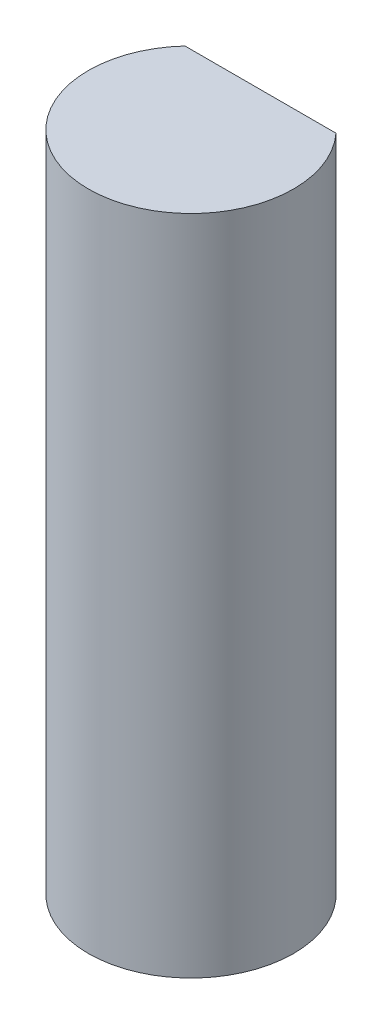
ISO-10303-21;
HEADER;
FILE_DESCRIPTION(('STEP AP214'),'2;1');
FILE_NAME('part.step','',(''),(''),'','','');
FILE_SCHEMA(('AUTOMOTIVE_DESIGN { 1 0 10303 214 1 1 1 1 }'));
ENDSEC;
DATA;
#1=APPLICATION_CONTEXT('core data for automotive mechanical design processes');
#2=APPLICATION_PROTOCOL_DEFINITION('international standard','automotive_design',2000,#1);
#3=PRODUCT_CONTEXT('',#1,'mechanical');
#4=PRODUCT('Part','Part','',(#3));
#5=PRODUCT_RELATED_PRODUCT_CATEGORY('part','',(#4));
#6=PRODUCT_DEFINITION_FORMATION('','',#4);
#7=PRODUCT_DEFINITION_CONTEXT('part definition',#1,'design');
#8=PRODUCT_DEFINITION('design','',#6,#7);
#9=PRODUCT_DEFINITION_SHAPE('','',#8);
#10=(LENGTH_UNIT() NAMED_UNIT(*) SI_UNIT(.MILLI.,.METRE.));
#11=(NAMED_UNIT(*) PLANE_ANGLE_UNIT() SI_UNIT($,.RADIAN.));
#12=(NAMED_UNIT(*) SI_UNIT($,.STERADIAN.) SOLID_ANGLE_UNIT());
#13=UNCERTAINTY_MEASURE_WITH_UNIT(LENGTH_MEASURE(1.E-05),#10,'distance_accuracy_value','');
#14=(GEOMETRIC_REPRESENTATION_CONTEXT(3) GLOBAL_UNCERTAINTY_ASSIGNED_CONTEXT((#13)) GLOBAL_UNIT_ASSIGNED_CONTEXT((#10,
#11,#12)) REPRESENTATION_CONTEXT('',''));
#15=CARTESIAN_POINT('',(0.,0.,0.));
#16=DIRECTION('',(0.,0.,1.));
#17=DIRECTION('',(1.,0.,0.));
#18=AXIS2_PLACEMENT_3D('',#15,#16,#17);
#19=CARTESIAN_POINT('',(0.,10.,0.));
#20=DIRECTION('',(0.,-1.,0.));
#21=DIRECTION('',(0.,0.,-1.));
#22=AXIS2_PLACEMENT_3D('',#19,#20,#21);
#23=CYLINDRICAL_SURFACE('',#22,1.55);
#24=CARTESIAN_POINT('',(0.,10.,0.));
#25=DIRECTION('',(0.,1.,0.));
#26=DIRECTION('',(0.,0.,1.));
#27=AXIS2_PLACEMENT_3D('',#24,#25,#26);
#28=CIRCLE('',#27,1.55);
#29=CARTESIAN_POINT('',(-1.14017542509914,10.,-1.05));
#30=VERTEX_POINT('',#29);
#31=CARTESIAN_POINT('',(1.14017542509914,10.,-1.05));
#32=VERTEX_POINT('',#31);
#33=EDGE_CURVE('E11',#30,#32,#28,.T.);
#34=ORIENTED_EDGE('',*,*,#33,.F.);
#35=DIRECTION('',(0.,1.,0.));
#36=VECTOR('',#35,1.);
#37=CARTESIAN_POINT('',(-1.14017542509914,0.999999999999999,-1.05));
#38=LINE('',#37,#36);
#39=CARTESIAN_POINT('',(-1.14017542509914,0.999999999999999,-1.05));
#40=VERTEX_POINT('',#39);
#41=EDGE_CURVE('E50',#40,#30,#38,.T.);
#42=ORIENTED_EDGE('',*,*,#41,.F.);
#43=CARTESIAN_POINT('',(0.,0.999999999999999,0.));
#44=DIRECTION('',(0.,1.,0.));
#45=DIRECTION('',(0.,0.,1.));
#46=AXIS2_PLACEMENT_3D('',#43,#44,#45);
#47=CIRCLE('',#46,1.55);
#48=CARTESIAN_POINT('',(1.14017542509914,0.999999999999999,-1.05));
#49=VERTEX_POINT('',#48);
#50=EDGE_CURVE('E65',#49,#40,#47,.T.);
#51=ORIENTED_EDGE('',*,*,#50,.F.);
#52=DIRECTION('',(0.,1.,0.));
#53=VECTOR('',#52,1.);
#54=CARTESIAN_POINT('',(1.14017542509914,0.999999999999999,-1.05));
#55=LINE('',#54,#53);
#56=EDGE_CURVE('E56',#49,#32,#55,.T.);
#57=ORIENTED_EDGE('',*,*,#56,.T.);
#58=EDGE_LOOP('',(#34,#42,#51,#57));
#59=FACE_BOUND('',#58,.T.);
#60=CARTESIAN_POINT('',(0.,0.,0.));
#61=DIRECTION('',(0.,1.,0.));
#62=DIRECTION('',(0.,0.,1.));
#63=AXIS2_PLACEMENT_3D('',#60,#61,#62);
#64=CIRCLE('',#63,1.55);
#65=CARTESIAN_POINT('',(0.,0.,1.55));
#66=VERTEX_POINT('',#65);
#67=EDGE_CURVE('E39',#66,#66,#64,.T.);
#68=ORIENTED_EDGE('',*,*,#67,.T.);
#69=EDGE_LOOP('',(#68));
#70=FACE_BOUND('',#69,.T.);
#71=ADVANCED_FACE('F36',(#59,#70),#23,.T.);
#72=CARTESIAN_POINT('',(0.,10.,0.));
#73=DIRECTION('',(0.,1.,0.));
#74=DIRECTION('',(0.,0.,1.));
#75=AXIS2_PLACEMENT_3D('',#72,#73,#74);
#76=PLANE('',#75);
#77=DIRECTION('',(1.,0.,0.));
#78=VECTOR('',#77,1.);
#79=CARTESIAN_POINT('',(-1.14017542509914,10.,-1.05));
#80=LINE('',#79,#78);
#81=EDGE_CURVE('E61',#30,#32,#80,.T.);
#82=ORIENTED_EDGE('',*,*,#81,.F.);
#83=ORIENTED_EDGE('',*,*,#33,.T.);
#84=EDGE_LOOP('',(#82,#83));
#85=FACE_BOUND('',#84,.T.);
#86=ADVANCED_FACE('F71',(#85),#76,.T.);
#87=CARTESIAN_POINT('',(0.,0.,0.));
#88=DIRECTION('',(0.,1.,0.));
#89=DIRECTION('',(0.,0.,1.));
#90=AXIS2_PLACEMENT_3D('',#87,#88,#89);
#91=PLANE('',#90);
#92=ORIENTED_EDGE('',*,*,#67,.F.);
#93=EDGE_LOOP('',(#92));
#94=FACE_BOUND('',#93,.T.);
#95=ADVANCED_FACE('F73',(#94),#91,.F.);
#96=CARTESIAN_POINT('',(-1.14017542509914,0.999999999999999,-1.05));
#97=DIRECTION('',(0.,0.,1.));
#98=DIRECTION('',(1.,0.,0.));
#99=AXIS2_PLACEMENT_3D('',#96,#97,#98);
#100=PLANE('',#99);
#101=ORIENTED_EDGE('',*,*,#81,.T.);
#102=ORIENTED_EDGE('',*,*,#56,.F.);
#103=DIRECTION('',(1.,0.,0.));
#104=VECTOR('',#103,1.);
#105=CARTESIAN_POINT('',(-1.14017542509914,0.999999999999999,-1.05));
#106=LINE('',#105,#104);
#107=EDGE_CURVE('E88',#40,#49,#106,.T.);
#108=ORIENTED_EDGE('',*,*,#107,.F.);
#109=ORIENTED_EDGE('',*,*,#41,.T.);
#110=EDGE_LOOP('',(#101,#102,#108,#109));
#111=FACE_BOUND('',#110,.T.);
#112=ADVANCED_FACE('F62',(#111),#100,.F.);
#113=CARTESIAN_POINT('',(0.,0.999999999999999,0.));
#114=DIRECTION('',(0.,1.,0.));
#115=DIRECTION('',(0.,0.,1.));
#116=AXIS2_PLACEMENT_3D('',#113,#114,#115);
#117=PLANE('',#116);
#118=ORIENTED_EDGE('',*,*,#50,.T.);
#119=ORIENTED_EDGE('',*,*,#107,.T.);
#120=EDGE_LOOP('',(#118,#119));
#121=FACE_BOUND('',#120,.T.);
#122=ADVANCED_FACE('F83',(#121),#117,.T.);
#123=CLOSED_SHELL('',(#71,#86,#95,#112,#122));
#124=MANIFOLD_SOLID_BREP('B2',#123);
#125=ADVANCED_BREP_SHAPE_REPRESENTATION('',(#18,#124),#14);
#126=SHAPE_DEFINITION_REPRESENTATION(#9,#125);
ENDSEC;
END-ISO-10303-21;
